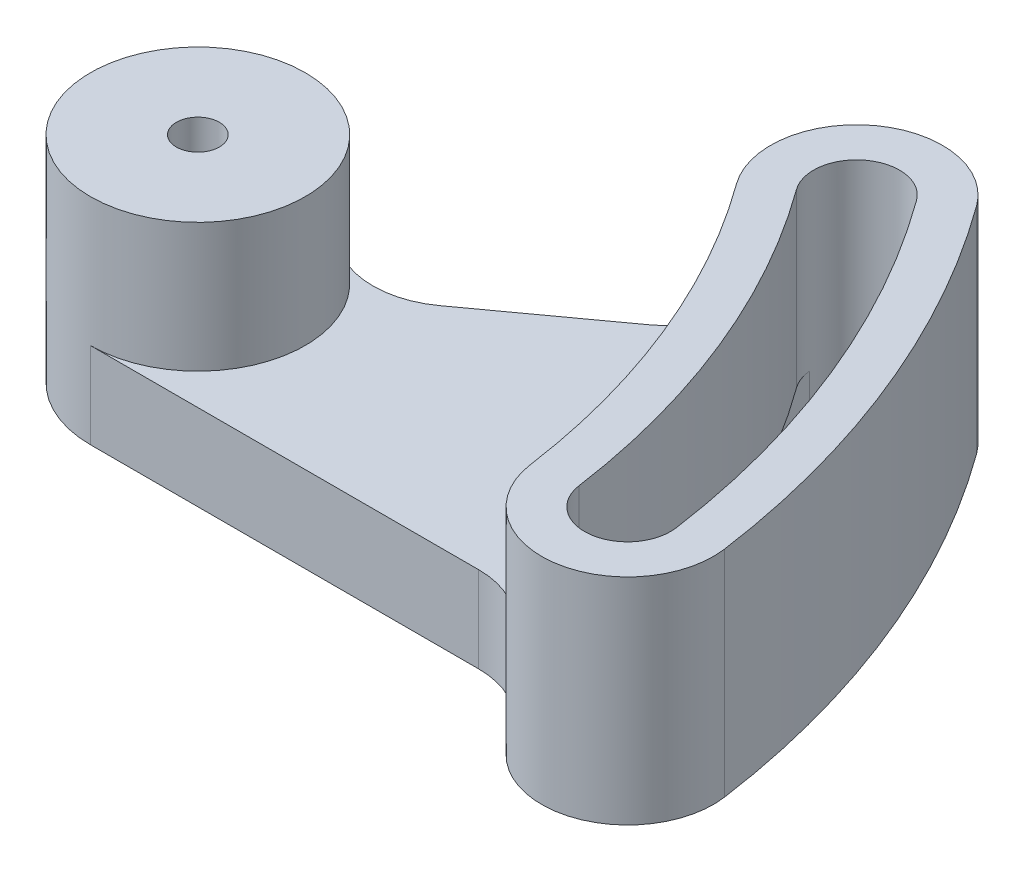
ISO-10303-21;
HEADER;
FILE_DESCRIPTION(('STEP AP214'),'2;1');
FILE_NAME('part.step','',(''),(''),'','','');
FILE_SCHEMA(('AUTOMOTIVE_DESIGN { 1 0 10303 214 1 1 1 1 }'));
ENDSEC;
DATA;
#1=APPLICATION_CONTEXT('core data for automotive mechanical design processes');
#2=APPLICATION_PROTOCOL_DEFINITION('international standard','automotive_design',2000,#1);
#3=PRODUCT_CONTEXT('',#1,'mechanical');
#4=PRODUCT('Part','Part','',(#3));
#5=PRODUCT_RELATED_PRODUCT_CATEGORY('part','',(#4));
#6=PRODUCT_DEFINITION_FORMATION('','',#4);
#7=PRODUCT_DEFINITION_CONTEXT('part definition',#1,'design');
#8=PRODUCT_DEFINITION('design','',#6,#7);
#9=PRODUCT_DEFINITION_SHAPE('','',#8);
#10=(LENGTH_UNIT() NAMED_UNIT(*) SI_UNIT(.MILLI.,.METRE.));
#11=(NAMED_UNIT(*) PLANE_ANGLE_UNIT() SI_UNIT($,.RADIAN.));
#12=(NAMED_UNIT(*) SI_UNIT($,.STERADIAN.) SOLID_ANGLE_UNIT());
#13=UNCERTAINTY_MEASURE_WITH_UNIT(LENGTH_MEASURE(1.E-05),#10,'distance_accuracy_value','');
#14=(GEOMETRIC_REPRESENTATION_CONTEXT(3) GLOBAL_UNCERTAINTY_ASSIGNED_CONTEXT((#13)) GLOBAL_UNIT_ASSIGNED_CONTEXT((#10,
#11,#12)) REPRESENTATION_CONTEXT('',''));
#15=CARTESIAN_POINT('',(0.,0.,0.));
#16=DIRECTION('',(0.,0.,1.));
#17=DIRECTION('',(1.,0.,0.));
#18=AXIS2_PLACEMENT_3D('',#15,#16,#17);
#19=CARTESIAN_POINT('',(0.,20.,25.));
#20=DIRECTION('',(0.,0.,1.));
#21=DIRECTION('',(1.,0.,0.));
#22=AXIS2_PLACEMENT_3D('',#19,#20,#21);
#23=PLANE('',#22);
#24=DIRECTION('',(-1.,0.,0.));
#25=VECTOR('',#24,1.);
#26=CARTESIAN_POINT('',(0.,0.,25.));
#27=LINE('',#26,#25);
#28=CARTESIAN_POINT('',(90.3589838486225,0.,25.));
#29=VERTEX_POINT('',#28);
#30=CARTESIAN_POINT('',(0.,0.,25.));
#31=VERTEX_POINT('',#30);
#32=EDGE_CURVE('E358',#29,#31,#27,.T.);
#33=ORIENTED_EDGE('',*,*,#32,.F.);
#34=DIRECTION('',(0.,-1.,0.));
#35=VECTOR('',#34,1.);
#36=CARTESIAN_POINT('',(90.3589838486225,20.,25.));
#37=LINE('',#36,#35);
#38=CARTESIAN_POINT('',(90.3589838486225,20.,25.));
#39=VERTEX_POINT('',#38);
#40=EDGE_CURVE('E400',#29,#39,#37,.F.);
#41=ORIENTED_EDGE('',*,*,#40,.T.);
#42=DIRECTION('',(-1.,0.,0.));
#43=VECTOR('',#42,1.);
#44=CARTESIAN_POINT('',(0.,20.,25.));
#45=LINE('',#44,#43);
#46=CARTESIAN_POINT('',(0.,20.,25.));
#47=VERTEX_POINT('',#46);
#48=EDGE_CURVE('E366',#39,#47,#45,.T.);
#49=ORIENTED_EDGE('',*,*,#48,.T.);
#50=DIRECTION('',(0.,-1.,0.));
#51=VECTOR('',#50,1.);
#52=CARTESIAN_POINT('',(0.,20.,25.));
#53=LINE('',#52,#51);
#54=EDGE_CURVE('E372',#47,#31,#53,.T.);
#55=ORIENTED_EDGE('',*,*,#54,.T.);
#56=EDGE_LOOP('',(#33,#41,#49,#55));
#57=FACE_BOUND('',#56,.T.);
#58=ADVANCED_FACE('F95',(#57),#23,.T.);
#59=CARTESIAN_POINT('',(0.,20.,0.));
#60=DIRECTION('',(-0.587785252292469,0.,-0.809016994374951));
#61=DIRECTION('',(-0.809016994374951,0.,0.587785252292469));
#62=AXIS2_PLACEMENT_3D('',#59,#60,#61);
#63=PLANE('',#62);
#64=DIRECTION('',(0.809016994374951,0.,-0.587785252292469));
#65=VECTOR('',#64,1.);
#66=CARTESIAN_POINT('',(0.,0.,0.));
#67=LINE('',#66,#65);
#68=CARTESIAN_POINT('',(32.6125176570232,0.,-23.6943810231529));
#69=VERTEX_POINT('',#68);
#70=CARTESIAN_POINT('',(60.755578647794,0.,-44.1415117011963));
#71=VERTEX_POINT('',#70);
#72=EDGE_CURVE('E367',#69,#71,#67,.T.);
#73=ORIENTED_EDGE('',*,*,#72,.F.);
#74=DIRECTION('',(0.,-1.,0.));
#75=VECTOR('',#74,1.);
#76=CARTESIAN_POINT('',(32.6125176570232,20.,-23.6943810231529));
#77=LINE('',#76,#75);
#78=CARTESIAN_POINT('',(32.6125176570232,20.,-23.6943810231529));
#79=VERTEX_POINT('',#78);
#80=EDGE_CURVE('E398',#69,#79,#77,.F.);
#81=ORIENTED_EDGE('',*,*,#80,.T.);
#82=DIRECTION('',(0.809016994374951,0.,-0.587785252292469));
#83=VECTOR('',#82,1.);
#84=CARTESIAN_POINT('',(0.,20.,0.));
#85=LINE('',#84,#83);
#86=CARTESIAN_POINT('',(60.755578647794,20.,-44.1415117011963));
#87=VERTEX_POINT('',#86);
#88=EDGE_CURVE('E369',#79,#87,#85,.T.);
#89=ORIENTED_EDGE('',*,*,#88,.T.);
#90=DIRECTION('',(0.,-1.,0.));
#91=VECTOR('',#90,1.);
#92=CARTESIAN_POINT('',(60.755578647794,0.,-44.1415117011963));
#93=LINE('',#92,#91);
#94=EDGE_CURVE('E396',#87,#71,#93,.T.);
#95=ORIENTED_EDGE('',*,*,#94,.T.);
#96=EDGE_LOOP('',(#73,#81,#89,#95));
#97=FACE_BOUND('',#96,.T.);
#98=ADVANCED_FACE('F432',(#97),#63,.T.);
#99=CARTESIAN_POINT('',(0.,20.,0.));
#100=DIRECTION('',(0.,1.,0.));
#101=DIRECTION('',(0.,0.,1.));
#102=AXIS2_PLACEMENT_3D('',#99,#100,#101);
#103=PLANE('',#102);
#104=ORIENTED_EDGE('',*,*,#48,.F.);
#105=CARTESIAN_POINT('',(90.3589838486225,20.,45.));
#106=DIRECTION('',(0.,1.,0.));
#107=DIRECTION('',(0.,0.,1.));
#108=AXIS2_PLACEMENT_3D('',#105,#106,#107);
#109=CIRCLE('',#108,20.);
#110=CARTESIAN_POINT('',(107.679491924311,20.,35.));
#111=VERTEX_POINT('',#110);
#112=EDGE_CURVE('E418',#39,#111,#109,.F.);
#113=ORIENTED_EDGE('',*,*,#112,.T.);
#114=CARTESIAN_POINT('',(125.,20.,25.));
#115=DIRECTION('',(0.,1.,0.));
#116=DIRECTION('',(0.,0.,1.));
#117=AXIS2_PLACEMENT_3D('',#114,#115,#116);
#118=CIRCLE('',#117,20.);
#119=CARTESIAN_POINT('',(105.197735054169,20.,27.8054060339092));
#120=VERTEX_POINT('',#119);
#121=EDGE_CURVE('E405',#120,#111,#118,.T.);
#122=ORIENTED_EDGE('',*,*,#121,.F.);
#123=CARTESIAN_POINT('',(-73.0226494583147,20.,53.0540603390926));
#124=DIRECTION('',(0.,1.,0.));
#125=DIRECTION('',(0.,0.,1.));
#126=AXIS2_PLACEMENT_3D('',#123,#124,#125);
#127=CIRCLE('',#126,180.);
#128=CARTESIAN_POINT('',(72.6004095291766,20.,-52.7472850735518));
#129=VERTEX_POINT('',#128);
#130=EDGE_CURVE('E388',#120,#129,#127,.T.);
#131=ORIENTED_EDGE('',*,*,#130,.T.);
#132=CARTESIAN_POINT('',(88.7807494166756,20.,-64.5029901194012));
#133=DIRECTION('',(0.,1.,0.));
#134=DIRECTION('',(0.,0.,1.));
#135=AXIS2_PLACEMENT_3D('',#132,#133,#134);
#136=CIRCLE('',#135,20.);
#137=CARTESIAN_POINT('',(68.8903115093101,20.,-62.4124208540482));
#138=VERTEX_POINT('',#137);
#139=EDGE_CURVE('E408',#138,#129,#136,.T.);
#140=ORIENTED_EDGE('',*,*,#139,.F.);
#141=CARTESIAN_POINT('',(48.9998736019446,20.,-60.3218515886953));
#142=DIRECTION('',(0.,1.,0.));
#143=DIRECTION('',(0.,0.,1.));
#144=AXIS2_PLACEMENT_3D('',#141,#142,#143);
#145=CIRCLE('',#144,20.);
#146=EDGE_CURVE('E103',#138,#87,#145,.F.);
#147=ORIENTED_EDGE('',*,*,#146,.T.);
#148=ORIENTED_EDGE('',*,*,#88,.F.);
#149=CARTESIAN_POINT('',(20.8568126111739,20.,-39.8747209106519));
#150=DIRECTION('',(0.,1.,0.));
#151=DIRECTION('',(0.,0.,1.));
#152=AXIS2_PLACEMENT_3D('',#149,#150,#151);
#153=CIRCLE('',#152,20.);
#154=CARTESIAN_POINT('',(11.5871181173188,20.,-22.1526227281399));
#155=VERTEX_POINT('',#154);
#156=EDGE_CURVE('E415',#79,#155,#153,.F.);
#157=ORIENTED_EDGE('',*,*,#156,.T.);
#158=CARTESIAN_POINT('',(0.,20.,0.));
#159=DIRECTION('',(0.,1.,0.));
#160=DIRECTION('',(0.,0.,1.));
#161=AXIS2_PLACEMENT_3D('',#158,#159,#160);
#162=CIRCLE('',#161,25.);
#163=EDGE_CURVE('E364',#47,#155,#162,.T.);
#164=ORIENTED_EDGE('',*,*,#163,.F.);
#165=EDGE_LOOP('',(#104,#113,#122,#131,#140,#147,#148,#157,#164));
#166=FACE_BOUND('',#165,.T.);
#167=ADVANCED_FACE('F425',(#166),#103,.T.);
#168=CARTESIAN_POINT('',(0.,50.,0.));
#169=DIRECTION('',(0.,-1.,0.));
#170=DIRECTION('',(0.,0.,-1.));
#171=AXIS2_PLACEMENT_3D('',#168,#169,#170);
#172=CYLINDRICAL_SURFACE('',#171,25.);
#173=CARTESIAN_POINT('',(0.,50.,0.));
#174=DIRECTION('',(0.,1.,0.));
#175=DIRECTION('',(0.,0.,1.));
#176=AXIS2_PLACEMENT_3D('',#173,#174,#175);
#177=CIRCLE('',#176,25.);
#178=CARTESIAN_POINT('',(0.,50.,25.));
#179=VERTEX_POINT('',#178);
#180=EDGE_CURVE('E385',#179,#179,#177,.T.);
#181=ORIENTED_EDGE('',*,*,#180,.F.);
#182=EDGE_LOOP('',(#181));
#183=FACE_BOUND('',#182,.T.);
#184=ORIENTED_EDGE('',*,*,#163,.T.);
#185=DIRECTION('',(0.,-1.,0.));
#186=VECTOR('',#185,1.);
#187=CARTESIAN_POINT('',(11.5871181173188,50.,-22.1526227281399));
#188=LINE('',#187,#186);
#189=CARTESIAN_POINT('',(11.5871181173188,0.,-22.1526227281399));
#190=VERTEX_POINT('',#189);
#191=EDGE_CURVE('E393',#155,#190,#188,.T.);
#192=ORIENTED_EDGE('',*,*,#191,.T.);
#193=CARTESIAN_POINT('',(0.,0.,0.));
#194=DIRECTION('',(0.,1.,0.));
#195=DIRECTION('',(0.,0.,1.));
#196=AXIS2_PLACEMENT_3D('',#193,#194,#195);
#197=CIRCLE('',#196,25.);
#198=EDGE_CURVE('E382',#190,#31,#197,.T.);
#199=ORIENTED_EDGE('',*,*,#198,.T.);
#200=ORIENTED_EDGE('',*,*,#54,.F.);
#201=EDGE_LOOP('',(#184,#192,#199,#200));
#202=FACE_BOUND('',#201,.T.);
#203=ADVANCED_FACE('F465',(#183,#202),#172,.T.);
#204=CARTESIAN_POINT('',(0.,50.,0.));
#205=DIRECTION('',(0.,1.,0.));
#206=DIRECTION('',(0.,0.,1.));
#207=AXIS2_PLACEMENT_3D('',#204,#205,#206);
#208=PLANE('',#207);
#209=ORIENTED_EDGE('',*,*,#180,.T.);
#210=EDGE_LOOP('',(#209));
#211=FACE_BOUND('',#210,.T.);
#212=CARTESIAN_POINT('',(0.,50.,0.));
#213=DIRECTION('',(0.,1.,0.));
#214=DIRECTION('',(0.,0.,1.));
#215=AXIS2_PLACEMENT_3D('',#212,#213,#214);
#216=CIRCLE('',#215,5.);
#217=CARTESIAN_POINT('',(0.,50.,5.));
#218=VERTEX_POINT('',#217);
#219=EDGE_CURVE('E379',#218,#218,#216,.T.);
#220=ORIENTED_EDGE('',*,*,#219,.F.);
#221=EDGE_LOOP('',(#220));
#222=FACE_BOUND('',#221,.T.);
#223=ADVANCED_FACE('F492',(#211,#222),#208,.T.);
#224=CARTESIAN_POINT('',(0.,0.,0.));
#225=DIRECTION('',(0.,1.,0.));
#226=DIRECTION('',(0.,0.,1.));
#227=AXIS2_PLACEMENT_3D('',#224,#225,#226);
#228=PLANE('',#227);
#229=CARTESIAN_POINT('',(90.3589838486225,0.,45.));
#230=DIRECTION('',(0.,1.,0.));
#231=DIRECTION('',(0.,0.,1.));
#232=AXIS2_PLACEMENT_3D('',#229,#230,#231);
#233=CIRCLE('',#232,30.);
#234=CARTESIAN_POINT('',(116.339745962156,0.,30.));
#235=VERTEX_POINT('',#234);
#236=CARTESIAN_POINT('',(90.3589838486225,0.,15.));
#237=VERTEX_POINT('',#236);
#238=EDGE_CURVE('E287',#235,#237,#233,.T.);
#239=ORIENTED_EDGE('',*,*,#238,.F.);
#240=CARTESIAN_POINT('',(125.,0.,25.));
#241=DIRECTION('',(0.,1.,0.));
#242=DIRECTION('',(0.,0.,1.));
#243=AXIS2_PLACEMENT_3D('',#240,#241,#242);
#244=CIRCLE('',#243,10.);
#245=CARTESIAN_POINT('',(134.901132472916,0.,23.5972969830454));
#246=VERTEX_POINT('',#245);
#247=EDGE_CURVE('E328',#235,#246,#244,.T.);
#248=ORIENTED_EDGE('',*,*,#247,.T.);
#249=CARTESIAN_POINT('',(-73.0226494583147,0.,53.0540603390926));
#250=DIRECTION('',(0.,1.,0.));
#251=DIRECTION('',(0.,0.,1.));
#252=AXIS2_PLACEMENT_3D('',#249,#250,#251);
#253=CIRCLE('',#252,210.);
#254=CARTESIAN_POINT('',(96.8709193604251,0.,-70.3808426423259));
#255=VERTEX_POINT('',#254);
#256=EDGE_CURVE('E314',#246,#255,#253,.T.);
#257=ORIENTED_EDGE('',*,*,#256,.T.);
#258=CARTESIAN_POINT('',(88.7807494166756,0.,-64.5029901194012));
#259=DIRECTION('',(0.,1.,0.));
#260=DIRECTION('',(0.,0.,1.));
#261=AXIS2_PLACEMENT_3D('',#258,#259,#260);
#262=CIRCLE('',#261,10.);
#263=CARTESIAN_POINT('',(78.8355304629928,0.,-63.4577054867247));
#264=VERTEX_POINT('',#263);
#265=EDGE_CURVE('E118',#255,#264,#262,.T.);
#266=ORIENTED_EDGE('',*,*,#265,.T.);
#267=CARTESIAN_POINT('',(48.9998736019446,0.,-60.3218515886953));
#268=DIRECTION('',(0.,1.,0.));
#269=DIRECTION('',(0.,0.,1.));
#270=AXIS2_PLACEMENT_3D('',#267,#268,#269);
#271=CIRCLE('',#270,30.);
#272=CARTESIAN_POINT('',(66.6334311707187,0.,-36.0513417574468));
#273=VERTEX_POINT('',#272);
#274=EDGE_CURVE('E298',#273,#264,#271,.T.);
#275=ORIENTED_EDGE('',*,*,#274,.F.);
#276=DIRECTION('',(0.809016994374951,0.,-0.587785252292469));
#277=VECTOR('',#276,1.);
#278=CARTESIAN_POINT('',(5.87785252292469,0.,8.09016994374951));
#279=LINE('',#278,#277);
#280=CARTESIAN_POINT('',(38.4903701799479,0.,-15.6042110794034));
#281=VERTEX_POINT('',#280);
#282=EDGE_CURVE('E306',#281,#273,#279,.T.);
#283=ORIENTED_EDGE('',*,*,#282,.F.);
#284=CARTESIAN_POINT('',(20.8568126111739,0.,-39.8747209106519));
#285=DIRECTION('',(0.,1.,0.));
#286=DIRECTION('',(0.,0.,1.));
#287=AXIS2_PLACEMENT_3D('',#284,#285,#286);
#288=CIRCLE('',#287,30.);
#289=CARTESIAN_POINT('',(6.9522708703913,0.,-13.291573636884));
#290=VERTEX_POINT('',#289);
#291=EDGE_CURVE('E303',#290,#281,#288,.T.);
#292=ORIENTED_EDGE('',*,*,#291,.F.);
#293=CARTESIAN_POINT('',(0.,0.,0.));
#294=DIRECTION('',(0.,1.,0.));
#295=DIRECTION('',(0.,0.,1.));
#296=AXIS2_PLACEMENT_3D('',#293,#294,#295);
#297=CIRCLE('',#296,15.);
#298=CARTESIAN_POINT('',(0.,0.,15.));
#299=VERTEX_POINT('',#298);
#300=EDGE_CURVE('E284',#299,#290,#297,.T.);
#301=ORIENTED_EDGE('',*,*,#300,.F.);
#302=DIRECTION('',(-1.,0.,0.));
#303=VECTOR('',#302,1.);
#304=CARTESIAN_POINT('',(0.,0.,15.));
#305=LINE('',#304,#303);
#306=EDGE_CURVE('E317',#237,#299,#305,.T.);
#307=ORIENTED_EDGE('',*,*,#306,.F.);
#308=EDGE_LOOP('',(#239,#248,#257,#266,#275,#283,#292,#301,#307));
#309=FACE_BOUND('',#308,.T.);
#310=CARTESIAN_POINT('',(125.,0.,25.));
#311=DIRECTION('',(0.,1.,0.));
#312=DIRECTION('',(0.,0.,1.));
#313=AXIS2_PLACEMENT_3D('',#310,#311,#312);
#314=CIRCLE('',#313,20.);
#315=CARTESIAN_POINT('',(107.679491924311,0.,35.));
#316=VERTEX_POINT('',#315);
#317=CARTESIAN_POINT('',(144.802264945832,0.,22.1945939660907));
#318=VERTEX_POINT('',#317);
#319=EDGE_CURVE('E350',#316,#318,#314,.T.);
#320=ORIENTED_EDGE('',*,*,#319,.F.);
#321=CARTESIAN_POINT('',(90.3589838486225,0.,45.));
#322=DIRECTION('',(0.,1.,0.));
#323=DIRECTION('',(0.,0.,1.));
#324=AXIS2_PLACEMENT_3D('',#321,#322,#323);
#325=CIRCLE('',#324,20.);
#326=EDGE_CURVE('E420',#316,#29,#325,.T.);
#327=ORIENTED_EDGE('',*,*,#326,.T.);
#328=ORIENTED_EDGE('',*,*,#32,.T.);
#329=ORIENTED_EDGE('',*,*,#198,.F.);
#330=CARTESIAN_POINT('',(20.8568126111739,0.,-39.8747209106519));
#331=DIRECTION('',(0.,1.,0.));
#332=DIRECTION('',(0.,0.,1.));
#333=AXIS2_PLACEMENT_3D('',#330,#331,#332);
#334=CIRCLE('',#333,20.);
#335=EDGE_CURVE('E413',#190,#69,#334,.T.);
#336=ORIENTED_EDGE('',*,*,#335,.T.);
#337=ORIENTED_EDGE('',*,*,#72,.T.);
#338=CARTESIAN_POINT('',(48.9998736019446,0.,-60.3218515886953));
#339=DIRECTION('',(0.,1.,0.));
#340=DIRECTION('',(0.,0.,1.));
#341=AXIS2_PLACEMENT_3D('',#338,#339,#340);
#342=CIRCLE('',#341,20.);
#343=CARTESIAN_POINT('',(68.8903115093101,0.,-62.4124208540482));
#344=VERTEX_POINT('',#343);
#345=EDGE_CURVE('E12',#71,#344,#342,.T.);
#346=ORIENTED_EDGE('',*,*,#345,.T.);
#347=CARTESIAN_POINT('',(88.7807494166756,0.,-64.5029901194012));
#348=DIRECTION('',(0.,1.,0.));
#349=DIRECTION('',(0.,0.,1.));
#350=AXIS2_PLACEMENT_3D('',#347,#348,#349);
#351=CIRCLE('',#350,20.);
#352=CARTESIAN_POINT('',(104.961089304175,0.,-76.2586951652506));
#353=VERTEX_POINT('',#352);
#354=EDGE_CURVE('E347',#353,#344,#351,.T.);
#355=ORIENTED_EDGE('',*,*,#354,.F.);
#356=CARTESIAN_POINT('',(-73.0226494583147,0.,53.0540603390926));
#357=DIRECTION('',(0.,1.,0.));
#358=DIRECTION('',(0.,0.,1.));
#359=AXIS2_PLACEMENT_3D('',#356,#357,#358);
#360=CIRCLE('',#359,220.);
#361=EDGE_CURVE('E352',#318,#353,#360,.T.);
#362=ORIENTED_EDGE('',*,*,#361,.F.);
#363=EDGE_LOOP('',(#320,#327,#328,#329,#336,#337,#346,#355,#362));
#364=FACE_BOUND('',#363,.T.);
#365=CARTESIAN_POINT('',(0.,0.,0.));
#366=DIRECTION('',(0.,1.,0.));
#367=DIRECTION('',(0.,0.,1.));
#368=AXIS2_PLACEMENT_3D('',#365,#366,#367);
#369=CIRCLE('',#368,5.);
#370=CARTESIAN_POINT('',(0.,0.,5.));
#371=VERTEX_POINT('',#370);
#372=EDGE_CURVE('E378',#371,#371,#369,.T.);
#373=ORIENTED_EDGE('',*,*,#372,.T.);
#374=EDGE_LOOP('',(#373));
#375=FACE_BOUND('',#374,.T.);
#376=ADVANCED_FACE('F438',(#309,#364,#375),#228,.F.);
#377=CARTESIAN_POINT('',(0.,50.,0.));
#378=DIRECTION('',(0.,-1.,0.));
#379=DIRECTION('',(0.,0.,-1.));
#380=AXIS2_PLACEMENT_3D('',#377,#378,#379);
#381=CYLINDRICAL_SURFACE('',#380,5.);
#382=ORIENTED_EDGE('',*,*,#219,.T.);
#383=EDGE_LOOP('',(#382));
#384=FACE_BOUND('',#383,.T.);
#385=ORIENTED_EDGE('',*,*,#372,.F.);
#386=EDGE_LOOP('',(#385));
#387=FACE_BOUND('',#386,.T.);
#388=ADVANCED_FACE('F488',(#384,#387),#381,.F.);
#389=CARTESIAN_POINT('',(0.,50.,0.));
#390=DIRECTION('',(0.,1.,0.));
#391=DIRECTION('',(0.,0.,1.));
#392=AXIS2_PLACEMENT_3D('',#389,#390,#391);
#393=PLANE('',#392);
#394=CARTESIAN_POINT('',(88.7807494166755,50.,-64.5029901194012));
#395=DIRECTION('',(0.,1.,0.));
#396=DIRECTION('',(0.,0.,1.));
#397=AXIS2_PLACEMENT_3D('',#394,#395,#396);
#398=CIRCLE('',#397,10.);
#399=CARTESIAN_POINT('',(96.8709193604251,50.,-70.3808426423258));
#400=VERTEX_POINT('',#399);
#401=CARTESIAN_POINT('',(80.690579472926,50.,-58.6251375964765));
#402=VERTEX_POINT('',#401);
#403=EDGE_CURVE('E262',#400,#402,#398,.T.);
#404=ORIENTED_EDGE('',*,*,#403,.F.);
#405=CARTESIAN_POINT('',(-73.0226494583147,50.,53.0540603390926));
#406=DIRECTION('',(0.,1.,0.));
#407=DIRECTION('',(0.,0.,1.));
#408=AXIS2_PLACEMENT_3D('',#405,#406,#407);
#409=CIRCLE('',#408,210.);
#410=CARTESIAN_POINT('',(134.901132472916,50.,23.5972969830454));
#411=VERTEX_POINT('',#410);
#412=EDGE_CURVE('E267',#411,#400,#409,.T.);
#413=ORIENTED_EDGE('',*,*,#412,.F.);
#414=CARTESIAN_POINT('',(125.,50.,25.));
#415=DIRECTION('',(0.,1.,0.));
#416=DIRECTION('',(0.,0.,1.));
#417=AXIS2_PLACEMENT_3D('',#414,#415,#416);
#418=CIRCLE('',#417,10.);
#419=CARTESIAN_POINT('',(115.098867527084,50.,26.4027030169546));
#420=VERTEX_POINT('',#419);
#421=EDGE_CURVE('E250',#420,#411,#418,.T.);
#422=ORIENTED_EDGE('',*,*,#421,.F.);
#423=CARTESIAN_POINT('',(-73.0226494583147,50.,53.0540603390926));
#424=DIRECTION('',(0.,1.,0.));
#425=DIRECTION('',(0.,0.,1.));
#426=AXIS2_PLACEMENT_3D('',#423,#424,#425);
#427=CIRCLE('',#426,190.);
#428=EDGE_CURVE('E258',#420,#402,#427,.T.);
#429=ORIENTED_EDGE('',*,*,#428,.T.);
#430=EDGE_LOOP('',(#404,#413,#422,#429));
#431=FACE_BOUND('',#430,.T.);
#432=CARTESIAN_POINT('',(88.7807494166756,50.,-64.5029901194012));
#433=DIRECTION('',(0.,1.,0.));
#434=DIRECTION('',(0.,0.,1.));
#435=AXIS2_PLACEMENT_3D('',#432,#433,#434);
#436=CIRCLE('',#435,20.);
#437=CARTESIAN_POINT('',(104.961089304175,50.,-76.2586951652506));
#438=VERTEX_POINT('',#437);
#439=CARTESIAN_POINT('',(72.6004095291766,50.,-52.7472850735518));
#440=VERTEX_POINT('',#439);
#441=EDGE_CURVE('E326',#438,#440,#436,.T.);
#442=ORIENTED_EDGE('',*,*,#441,.T.);
#443=CARTESIAN_POINT('',(-73.0226494583147,50.,53.0540603390926));
#444=DIRECTION('',(0.,1.,0.));
#445=DIRECTION('',(0.,0.,1.));
#446=AXIS2_PLACEMENT_3D('',#443,#444,#445);
#447=CIRCLE('',#446,180.);
#448=CARTESIAN_POINT('',(105.197735054169,50.,27.8054060339092));
#449=VERTEX_POINT('',#448);
#450=EDGE_CURVE('E338',#449,#440,#447,.T.);
#451=ORIENTED_EDGE('',*,*,#450,.F.);
#452=CARTESIAN_POINT('',(125.,50.,25.));
#453=DIRECTION('',(0.,1.,0.));
#454=DIRECTION('',(0.,0.,1.));
#455=AXIS2_PLACEMENT_3D('',#452,#453,#454);
#456=CIRCLE('',#455,20.);
#457=CARTESIAN_POINT('',(144.802264945832,50.,22.1945939660907));
#458=VERTEX_POINT('',#457);
#459=EDGE_CURVE('E341',#449,#458,#456,.T.);
#460=ORIENTED_EDGE('',*,*,#459,.T.);
#461=CARTESIAN_POINT('',(-73.0226494583147,50.,53.0540603390926));
#462=DIRECTION('',(0.,1.,0.));
#463=DIRECTION('',(0.,0.,1.));
#464=AXIS2_PLACEMENT_3D('',#461,#462,#463);
#465=CIRCLE('',#464,220.);
#466=EDGE_CURVE('E344',#458,#438,#465,.T.);
#467=ORIENTED_EDGE('',*,*,#466,.T.);
#468=EDGE_LOOP('',(#442,#451,#460,#467));
#469=FACE_BOUND('',#468,.T.);
#470=ADVANCED_FACE('F264',(#431,#469),#393,.T.);
#471=CARTESIAN_POINT('',(88.7807494166756,0.,-64.5029901194012));
#472=DIRECTION('',(0.,1.,0.));
#473=DIRECTION('',(0.,0.,1.));
#474=AXIS2_PLACEMENT_3D('',#471,#472,#473);
#475=CYLINDRICAL_SURFACE('',#474,20.);
#476=ORIENTED_EDGE('',*,*,#354,.T.);
#477=DIRECTION('',(0.,1.,0.));
#478=VECTOR('',#477,1.);
#479=CARTESIAN_POINT('',(68.8903115093101,0.,-62.4124208540482));
#480=LINE('',#479,#478);
#481=EDGE_CURVE('E410',#344,#138,#480,.T.);
#482=ORIENTED_EDGE('',*,*,#481,.T.);
#483=ORIENTED_EDGE('',*,*,#139,.T.);
#484=DIRECTION('',(0.,1.,0.));
#485=VECTOR('',#484,1.);
#486=CARTESIAN_POINT('',(72.6004095291766,0.,-52.7472850735518));
#487=LINE('',#486,#485);
#488=EDGE_CURVE('E355',#129,#440,#487,.T.);
#489=ORIENTED_EDGE('',*,*,#488,.T.);
#490=ORIENTED_EDGE('',*,*,#441,.F.);
#491=DIRECTION('',(0.,1.,0.));
#492=VECTOR('',#491,1.);
#493=CARTESIAN_POINT('',(104.961089304175,0.,-76.2586951652506));
#494=LINE('',#493,#492);
#495=EDGE_CURVE('E356',#353,#438,#494,.T.);
#496=ORIENTED_EDGE('',*,*,#495,.F.);
#497=EDGE_LOOP('',(#476,#482,#483,#489,#490,#496));
#498=FACE_BOUND('',#497,.T.);
#499=ADVANCED_FACE('F442',(#498),#475,.T.);
#500=CARTESIAN_POINT('',(-73.0226494583147,0.,53.0540603390926));
#501=DIRECTION('',(0.,1.,0.));
#502=DIRECTION('',(0.,0.,1.));
#503=AXIS2_PLACEMENT_3D('',#500,#501,#502);
#504=CYLINDRICAL_SURFACE('',#503,220.);
#505=ORIENTED_EDGE('',*,*,#495,.T.);
#506=ORIENTED_EDGE('',*,*,#466,.F.);
#507=DIRECTION('',(0.,1.,0.));
#508=VECTOR('',#507,1.);
#509=CARTESIAN_POINT('',(144.802264945832,0.,22.1945939660907));
#510=LINE('',#509,#508);
#511=EDGE_CURVE('E359',#318,#458,#510,.T.);
#512=ORIENTED_EDGE('',*,*,#511,.F.);
#513=ORIENTED_EDGE('',*,*,#361,.T.);
#514=EDGE_LOOP('',(#505,#506,#512,#513));
#515=FACE_BOUND('',#514,.T.);
#516=ADVANCED_FACE('F446',(#515),#504,.T.);
#517=CARTESIAN_POINT('',(125.,0.,25.));
#518=DIRECTION('',(0.,1.,0.));
#519=DIRECTION('',(0.,0.,1.));
#520=AXIS2_PLACEMENT_3D('',#517,#518,#519);
#521=CYLINDRICAL_SURFACE('',#520,20.);
#522=DIRECTION('',(0.,1.,0.));
#523=VECTOR('',#522,1.);
#524=CARTESIAN_POINT('',(105.197735054169,0.,27.8054060339092));
#525=LINE('',#524,#523);
#526=EDGE_CURVE('E361',#120,#449,#525,.T.);
#527=ORIENTED_EDGE('',*,*,#526,.F.);
#528=ORIENTED_EDGE('',*,*,#121,.T.);
#529=DIRECTION('',(0.,1.,0.));
#530=VECTOR('',#529,1.);
#531=CARTESIAN_POINT('',(107.679491924311,0.,35.));
#532=LINE('',#531,#530);
#533=EDGE_CURVE('E403',#111,#316,#532,.F.);
#534=ORIENTED_EDGE('',*,*,#533,.T.);
#535=ORIENTED_EDGE('',*,*,#319,.T.);
#536=ORIENTED_EDGE('',*,*,#511,.T.);
#537=ORIENTED_EDGE('',*,*,#459,.F.);
#538=EDGE_LOOP('',(#527,#528,#534,#535,#536,#537));
#539=FACE_BOUND('',#538,.T.);
#540=ADVANCED_FACE('F452',(#539),#521,.T.);
#541=CARTESIAN_POINT('',(-73.0226494583147,0.,53.0540603390926));
#542=DIRECTION('',(0.,1.,0.));
#543=DIRECTION('',(0.,0.,1.));
#544=AXIS2_PLACEMENT_3D('',#541,#542,#543);
#545=CYLINDRICAL_SURFACE('',#544,180.);
#546=ORIENTED_EDGE('',*,*,#130,.F.);
#547=ORIENTED_EDGE('',*,*,#526,.T.);
#548=ORIENTED_EDGE('',*,*,#450,.T.);
#549=ORIENTED_EDGE('',*,*,#488,.F.);
#550=EDGE_LOOP('',(#546,#547,#548,#549));
#551=FACE_BOUND('',#550,.T.);
#552=ADVANCED_FACE('F470',(#551),#545,.F.);
#553=CARTESIAN_POINT('',(20.8568126111739,50.,-39.8747209106519));
#554=DIRECTION('',(0.,-1.,0.));
#555=DIRECTION('',(0.,0.,-1.));
#556=AXIS2_PLACEMENT_3D('',#553,#554,#555);
#557=CYLINDRICAL_SURFACE('',#556,20.);
#558=ORIENTED_EDGE('',*,*,#156,.F.);
#559=ORIENTED_EDGE('',*,*,#80,.F.);
#560=ORIENTED_EDGE('',*,*,#335,.F.);
#561=ORIENTED_EDGE('',*,*,#191,.F.);
#562=EDGE_LOOP('',(#558,#559,#560,#561));
#563=FACE_BOUND('',#562,.T.);
#564=ADVANCED_FACE('F468',(#563),#557,.F.);
#565=CARTESIAN_POINT('',(90.3589838486225,0.,45.));
#566=DIRECTION('',(0.,1.,0.));
#567=DIRECTION('',(0.,0.,1.));
#568=AXIS2_PLACEMENT_3D('',#565,#566,#567);
#569=CYLINDRICAL_SURFACE('',#568,20.);
#570=ORIENTED_EDGE('',*,*,#326,.F.);
#571=ORIENTED_EDGE('',*,*,#533,.F.);
#572=ORIENTED_EDGE('',*,*,#112,.F.);
#573=ORIENTED_EDGE('',*,*,#40,.F.);
#574=EDGE_LOOP('',(#570,#571,#572,#573));
#575=FACE_BOUND('',#574,.T.);
#576=ADVANCED_FACE('F458',(#575),#569,.F.);
#577=CARTESIAN_POINT('',(48.9998736019446,0.,-60.3218515886953));
#578=DIRECTION('',(0.,1.,0.));
#579=DIRECTION('',(0.,0.,1.));
#580=AXIS2_PLACEMENT_3D('',#577,#578,#579);
#581=CYLINDRICAL_SURFACE('',#580,20.);
#582=ORIENTED_EDGE('',*,*,#345,.F.);
#583=ORIENTED_EDGE('',*,*,#94,.F.);
#584=ORIENTED_EDGE('',*,*,#146,.F.);
#585=ORIENTED_EDGE('',*,*,#481,.F.);
#586=EDGE_LOOP('',(#582,#583,#584,#585));
#587=FACE_BOUND('',#586,.T.);
#588=ADVANCED_FACE('F97',(#587),#581,.F.);
#589=CARTESIAN_POINT('',(0.,20.,15.));
#590=DIRECTION('',(0.,0.,1.));
#591=DIRECTION('',(1.,0.,0.));
#592=AXIS2_PLACEMENT_3D('',#589,#590,#591);
#593=PLANE('',#592);
#594=ORIENTED_EDGE('',*,*,#306,.T.);
#595=DIRECTION('',(0.,1.,0.));
#596=VECTOR('',#595,1.);
#597=CARTESIAN_POINT('',(0.,20.,15.));
#598=LINE('',#597,#596);
#599=CARTESIAN_POINT('',(0.,10.,15.));
#600=VERTEX_POINT('',#599);
#601=EDGE_CURVE('E282',#600,#299,#598,.F.);
#602=ORIENTED_EDGE('',*,*,#601,.F.);
#603=DIRECTION('',(-1.,0.,0.));
#604=VECTOR('',#603,1.);
#605=CARTESIAN_POINT('',(0.,10.,15.));
#606=LINE('',#605,#604);
#607=CARTESIAN_POINT('',(90.3589838486225,10.,15.));
#608=VERTEX_POINT('',#607);
#609=EDGE_CURVE('E277',#608,#600,#606,.T.);
#610=ORIENTED_EDGE('',*,*,#609,.F.);
#611=DIRECTION('',(0.,1.,0.));
#612=VECTOR('',#611,1.);
#613=CARTESIAN_POINT('',(90.3589838486225,20.,15.));
#614=LINE('',#613,#612);
#615=EDGE_CURVE('E272',#237,#608,#614,.T.);
#616=ORIENTED_EDGE('',*,*,#615,.F.);
#617=EDGE_LOOP('',(#594,#602,#610,#616));
#618=FACE_BOUND('',#617,.T.);
#619=ADVANCED_FACE('F552',(#618),#593,.F.);
#620=CARTESIAN_POINT('',(5.87785252292469,20.,8.09016994374951));
#621=DIRECTION('',(-0.587785252292469,0.,-0.809016994374951));
#622=DIRECTION('',(-0.809016994374951,0.,0.587785252292469));
#623=AXIS2_PLACEMENT_3D('',#620,#621,#622);
#624=PLANE('',#623);
#625=ORIENTED_EDGE('',*,*,#282,.T.);
#626=DIRECTION('',(0.,1.,0.));
#627=VECTOR('',#626,1.);
#628=CARTESIAN_POINT('',(66.6334311707187,20.,-36.0513417574468));
#629=LINE('',#628,#627);
#630=CARTESIAN_POINT('',(66.6334311707187,10.,-36.0513417574468));
#631=VERTEX_POINT('',#630);
#632=EDGE_CURVE('E308',#631,#273,#629,.F.);
#633=ORIENTED_EDGE('',*,*,#632,.F.);
#634=DIRECTION('',(0.809016994374951,0.,-0.587785252292469));
#635=VECTOR('',#634,1.);
#636=CARTESIAN_POINT('',(5.87785252292469,10.,8.09016994374951));
#637=LINE('',#636,#635);
#638=CARTESIAN_POINT('',(38.4903701799479,10.,-15.6042110794034));
#639=VERTEX_POINT('',#638);
#640=EDGE_CURVE('E280',#639,#631,#637,.T.);
#641=ORIENTED_EDGE('',*,*,#640,.F.);
#642=DIRECTION('',(0.,1.,0.));
#643=VECTOR('',#642,1.);
#644=CARTESIAN_POINT('',(38.4903701799479,20.,-15.6042110794034));
#645=LINE('',#644,#643);
#646=EDGE_CURVE('E276',#281,#639,#645,.T.);
#647=ORIENTED_EDGE('',*,*,#646,.F.);
#648=EDGE_LOOP('',(#625,#633,#641,#647));
#649=FACE_BOUND('',#648,.T.);
#650=ADVANCED_FACE('F548',(#649),#624,.F.);
#651=CARTESIAN_POINT('',(0.,10.,0.));
#652=DIRECTION('',(0.,1.,0.));
#653=DIRECTION('',(0.,0.,1.));
#654=AXIS2_PLACEMENT_3D('',#651,#652,#653);
#655=PLANE('',#654);
#656=ORIENTED_EDGE('',*,*,#609,.T.);
#657=CARTESIAN_POINT('',(0.,10.,0.));
#658=DIRECTION('',(0.,1.,0.));
#659=DIRECTION('',(0.,0.,1.));
#660=AXIS2_PLACEMENT_3D('',#657,#658,#659);
#661=CIRCLE('',#660,15.);
#662=CARTESIAN_POINT('',(6.95227087039129,10.,-13.291573636884));
#663=VERTEX_POINT('',#662);
#664=EDGE_CURVE('E281',#600,#663,#661,.T.);
#665=ORIENTED_EDGE('',*,*,#664,.T.);
#666=CARTESIAN_POINT('',(20.8568126111739,10.,-39.8747209106519));
#667=DIRECTION('',(0.,1.,0.));
#668=DIRECTION('',(0.,0.,1.));
#669=AXIS2_PLACEMENT_3D('',#666,#667,#668);
#670=CIRCLE('',#669,30.);
#671=EDGE_CURVE('E288',#639,#663,#670,.F.);
#672=ORIENTED_EDGE('',*,*,#671,.F.);
#673=ORIENTED_EDGE('',*,*,#640,.T.);
#674=CARTESIAN_POINT('',(48.9998736019446,10.,-60.3218515886953));
#675=DIRECTION('',(0.,1.,0.));
#676=DIRECTION('',(0.,0.,1.));
#677=AXIS2_PLACEMENT_3D('',#674,#675,#676);
#678=CIRCLE('',#677,30.);
#679=CARTESIAN_POINT('',(78.8355304629928,10.,-63.4577054867247));
#680=VERTEX_POINT('',#679);
#681=EDGE_CURVE('E296',#680,#631,#678,.F.);
#682=ORIENTED_EDGE('',*,*,#681,.F.);
#683=CARTESIAN_POINT('',(88.7807494166756,10.,-64.5029901194012));
#684=DIRECTION('',(0.,1.,0.));
#685=DIRECTION('',(0.,0.,1.));
#686=AXIS2_PLACEMENT_3D('',#683,#684,#685);
#687=CIRCLE('',#686,10.);
#688=CARTESIAN_POINT('',(80.6905794729261,10.,-58.6251375964765));
#689=VERTEX_POINT('',#688);
#690=EDGE_CURVE('E290',#680,#689,#687,.T.);
#691=ORIENTED_EDGE('',*,*,#690,.T.);
#692=CARTESIAN_POINT('',(-73.0226494583147,10.,53.0540603390926));
#693=DIRECTION('',(0.,1.,0.));
#694=DIRECTION('',(0.,0.,1.));
#695=AXIS2_PLACEMENT_3D('',#692,#693,#694);
#696=CIRCLE('',#695,190.);
#697=CARTESIAN_POINT('',(115.098867527084,10.,26.4027030169546));
#698=VERTEX_POINT('',#697);
#699=EDGE_CURVE('E291',#698,#689,#696,.T.);
#700=ORIENTED_EDGE('',*,*,#699,.F.);
#701=CARTESIAN_POINT('',(125.,10.,25.));
#702=DIRECTION('',(0.,1.,0.));
#703=DIRECTION('',(0.,0.,1.));
#704=AXIS2_PLACEMENT_3D('',#701,#702,#703);
#705=CIRCLE('',#704,10.);
#706=CARTESIAN_POINT('',(116.339745962156,10.,30.));
#707=VERTEX_POINT('',#706);
#708=EDGE_CURVE('E254',#698,#707,#705,.T.);
#709=ORIENTED_EDGE('',*,*,#708,.T.);
#710=CARTESIAN_POINT('',(90.3589838486225,10.,45.));
#711=DIRECTION('',(0.,1.,0.));
#712=DIRECTION('',(0.,0.,1.));
#713=AXIS2_PLACEMENT_3D('',#710,#711,#712);
#714=CIRCLE('',#713,30.);
#715=EDGE_CURVE('E285',#608,#707,#714,.F.);
#716=ORIENTED_EDGE('',*,*,#715,.F.);
#717=EDGE_LOOP('',(#656,#665,#672,#673,#682,#691,#700,#709,#716));
#718=FACE_BOUND('',#717,.T.);
#719=ADVANCED_FACE('F544',(#718),#655,.F.);
#720=CARTESIAN_POINT('',(0.,50.,0.));
#721=DIRECTION('',(0.,-1.,0.));
#722=DIRECTION('',(0.,0.,-1.));
#723=AXIS2_PLACEMENT_3D('',#720,#721,#722);
#724=CYLINDRICAL_SURFACE('',#723,15.);
#725=ORIENTED_EDGE('',*,*,#300,.T.);
#726=DIRECTION('',(0.,-1.,0.));
#727=VECTOR('',#726,1.);
#728=CARTESIAN_POINT('',(6.95227087039129,50.,-13.291573636884));
#729=LINE('',#728,#727);
#730=EDGE_CURVE('E293',#663,#290,#729,.T.);
#731=ORIENTED_EDGE('',*,*,#730,.F.);
#732=ORIENTED_EDGE('',*,*,#664,.F.);
#733=ORIENTED_EDGE('',*,*,#601,.T.);
#734=EDGE_LOOP('',(#725,#731,#732,#733));
#735=FACE_BOUND('',#734,.T.);
#736=ADVANCED_FACE('F541',(#735),#724,.T.);
#737=CARTESIAN_POINT('',(88.7807494166756,0.,-64.5029901194012));
#738=DIRECTION('',(0.,1.,0.));
#739=DIRECTION('',(0.,0.,1.));
#740=AXIS2_PLACEMENT_3D('',#737,#738,#739);
#741=CYLINDRICAL_SURFACE('',#740,10.);
#742=ORIENTED_EDGE('',*,*,#265,.F.);
#743=DIRECTION('',(0.,1.,0.));
#744=VECTOR('',#743,1.);
#745=CARTESIAN_POINT('',(96.8709193604251,0.,-70.3808426423258));
#746=LINE('',#745,#744);
#747=EDGE_CURVE('E315',#255,#400,#746,.T.);
#748=ORIENTED_EDGE('',*,*,#747,.T.);
#749=ORIENTED_EDGE('',*,*,#403,.T.);
#750=DIRECTION('',(0.,1.,0.));
#751=VECTOR('',#750,1.);
#752=CARTESIAN_POINT('',(80.6905794729261,0.,-58.6251375964765));
#753=LINE('',#752,#751);
#754=EDGE_CURVE('E110',#689,#402,#753,.T.);
#755=ORIENTED_EDGE('',*,*,#754,.F.);
#756=ORIENTED_EDGE('',*,*,#690,.F.);
#757=DIRECTION('',(0.,1.,0.));
#758=VECTOR('',#757,1.);
#759=CARTESIAN_POINT('',(78.8355304629928,0.,-63.4577054867247));
#760=LINE('',#759,#758);
#761=EDGE_CURVE('E295',#264,#680,#760,.T.);
#762=ORIENTED_EDGE('',*,*,#761,.F.);
#763=EDGE_LOOP('',(#742,#748,#749,#755,#756,#762));
#764=FACE_BOUND('',#763,.T.);
#765=ADVANCED_FACE('F537',(#764),#741,.F.);
#766=CARTESIAN_POINT('',(-73.0226494583147,0.,53.0540603390926));
#767=DIRECTION('',(0.,1.,0.));
#768=DIRECTION('',(0.,0.,1.));
#769=AXIS2_PLACEMENT_3D('',#766,#767,#768);
#770=CYLINDRICAL_SURFACE('',#769,210.);
#771=ORIENTED_EDGE('',*,*,#747,.F.);
#772=ORIENTED_EDGE('',*,*,#256,.F.);
#773=DIRECTION('',(0.,1.,0.));
#774=VECTOR('',#773,1.);
#775=CARTESIAN_POINT('',(134.901132472916,0.,23.5972969830454));
#776=LINE('',#775,#774);
#777=EDGE_CURVE('E255',#246,#411,#776,.T.);
#778=ORIENTED_EDGE('',*,*,#777,.T.);
#779=ORIENTED_EDGE('',*,*,#412,.T.);
#780=EDGE_LOOP('',(#771,#772,#778,#779));
#781=FACE_BOUND('',#780,.T.);
#782=ADVANCED_FACE('F534',(#781),#770,.F.);
#783=CARTESIAN_POINT('',(125.,0.,25.));
#784=DIRECTION('',(0.,1.,0.));
#785=DIRECTION('',(0.,0.,1.));
#786=AXIS2_PLACEMENT_3D('',#783,#784,#785);
#787=CYLINDRICAL_SURFACE('',#786,10.);
#788=DIRECTION('',(0.,1.,0.));
#789=VECTOR('',#788,1.);
#790=CARTESIAN_POINT('',(115.098867527084,0.,26.4027030169546));
#791=LINE('',#790,#789);
#792=EDGE_CURVE('E247',#698,#420,#791,.T.);
#793=ORIENTED_EDGE('',*,*,#792,.T.);
#794=ORIENTED_EDGE('',*,*,#421,.T.);
#795=ORIENTED_EDGE('',*,*,#777,.F.);
#796=ORIENTED_EDGE('',*,*,#247,.F.);
#797=DIRECTION('',(0.,1.,0.));
#798=VECTOR('',#797,1.);
#799=CARTESIAN_POINT('',(116.339745962156,0.,30.));
#800=LINE('',#799,#798);
#801=EDGE_CURVE('E275',#707,#235,#800,.F.);
#802=ORIENTED_EDGE('',*,*,#801,.F.);
#803=ORIENTED_EDGE('',*,*,#708,.F.);
#804=EDGE_LOOP('',(#793,#794,#795,#796,#802,#803));
#805=FACE_BOUND('',#804,.T.);
#806=ADVANCED_FACE('F248',(#805),#787,.F.);
#807=CARTESIAN_POINT('',(-73.0226494583147,0.,53.0540603390926));
#808=DIRECTION('',(0.,1.,0.));
#809=DIRECTION('',(0.,0.,1.));
#810=AXIS2_PLACEMENT_3D('',#807,#808,#809);
#811=CYLINDRICAL_SURFACE('',#810,190.);
#812=ORIENTED_EDGE('',*,*,#699,.T.);
#813=ORIENTED_EDGE('',*,*,#754,.T.);
#814=ORIENTED_EDGE('',*,*,#428,.F.);
#815=ORIENTED_EDGE('',*,*,#792,.F.);
#816=EDGE_LOOP('',(#812,#813,#814,#815));
#817=FACE_BOUND('',#816,.T.);
#818=ADVANCED_FACE('F259',(#817),#811,.T.);
#819=CARTESIAN_POINT('',(20.8568126111739,50.,-39.8747209106519));
#820=DIRECTION('',(0.,-1.,0.));
#821=DIRECTION('',(0.,0.,-1.));
#822=AXIS2_PLACEMENT_3D('',#819,#820,#821);
#823=CYLINDRICAL_SURFACE('',#822,30.);
#824=ORIENTED_EDGE('',*,*,#671,.T.);
#825=ORIENTED_EDGE('',*,*,#730,.T.);
#826=ORIENTED_EDGE('',*,*,#291,.T.);
#827=ORIENTED_EDGE('',*,*,#646,.T.);
#828=EDGE_LOOP('',(#824,#825,#826,#827));
#829=FACE_BOUND('',#828,.T.);
#830=ADVANCED_FACE('F525',(#829),#823,.T.);
#831=CARTESIAN_POINT('',(90.3589838486225,0.,45.));
#832=DIRECTION('',(0.,1.,0.));
#833=DIRECTION('',(0.,0.,1.));
#834=AXIS2_PLACEMENT_3D('',#831,#832,#833);
#835=CYLINDRICAL_SURFACE('',#834,30.);
#836=ORIENTED_EDGE('',*,*,#238,.T.);
#837=ORIENTED_EDGE('',*,*,#615,.T.);
#838=ORIENTED_EDGE('',*,*,#715,.T.);
#839=ORIENTED_EDGE('',*,*,#801,.T.);
#840=EDGE_LOOP('',(#836,#837,#838,#839));
#841=FACE_BOUND('',#840,.T.);
#842=ADVANCED_FACE('F521',(#841),#835,.T.);
#843=CARTESIAN_POINT('',(48.9998736019446,0.,-60.3218515886953));
#844=DIRECTION('',(0.,1.,0.));
#845=DIRECTION('',(0.,0.,1.));
#846=AXIS2_PLACEMENT_3D('',#843,#844,#845);
#847=CYLINDRICAL_SURFACE('',#846,30.);
#848=ORIENTED_EDGE('',*,*,#274,.T.);
#849=ORIENTED_EDGE('',*,*,#761,.T.);
#850=ORIENTED_EDGE('',*,*,#681,.T.);
#851=ORIENTED_EDGE('',*,*,#632,.T.);
#852=EDGE_LOOP('',(#848,#849,#850,#851));
#853=FACE_BOUND('',#852,.T.);
#854=ADVANCED_FACE('F518',(#853),#847,.T.);
#855=CLOSED_SHELL('',(#58,#98,#167,#203,#223,#376,#388,#470,#499,#516,#540,#552,#564,#576,#588,
#619,#650,#719,#736,#765,#782,#806,#818,#830,#842,#854));
#856=MANIFOLD_SOLID_BREP('B2',#855);
#857=ADVANCED_BREP_SHAPE_REPRESENTATION('',(#18,#856),#14);
#858=SHAPE_DEFINITION_REPRESENTATION(#9,#857);
ENDSEC;
END-ISO-10303-21;
